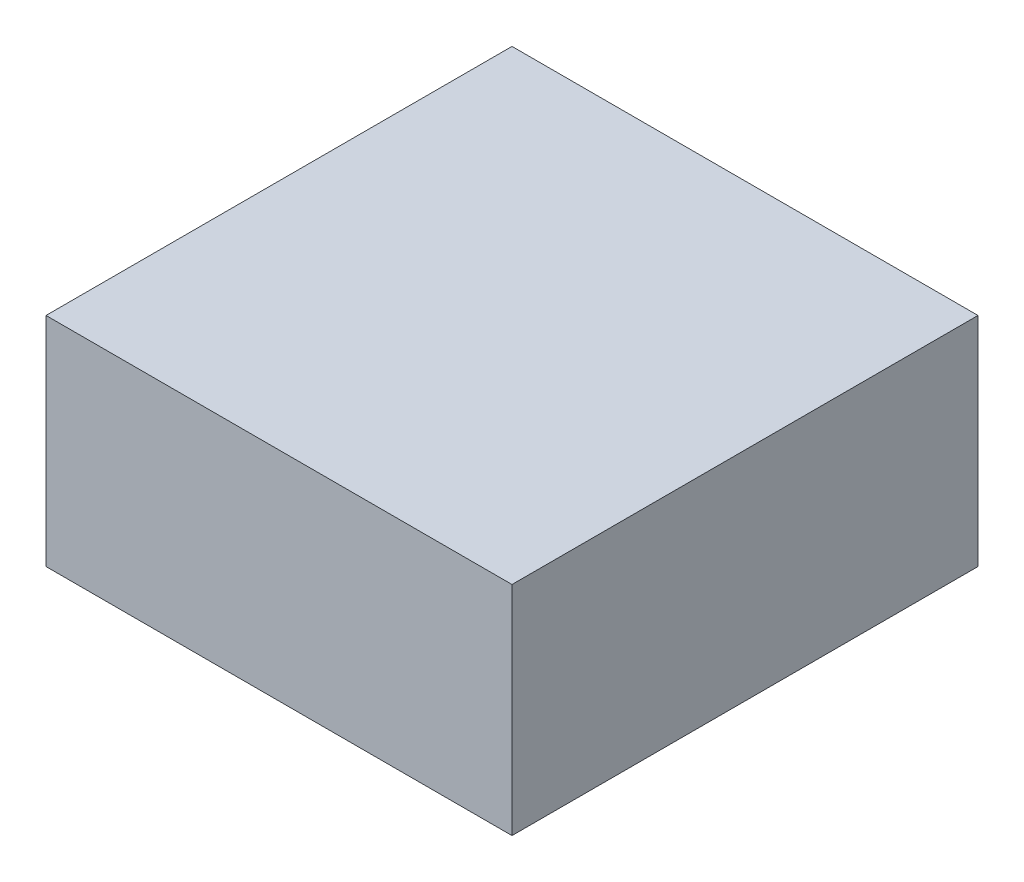
ISO-10303-21;
HEADER;
FILE_DESCRIPTION(('STEP AP214'),'2;1');
FILE_NAME('part.step','',(''),(''),'','','');
FILE_SCHEMA(('AUTOMOTIVE_DESIGN { 1 0 10303 214 1 1 1 1 }'));
ENDSEC;
DATA;
#1=APPLICATION_CONTEXT('core data for automotive mechanical design processes');
#2=APPLICATION_PROTOCOL_DEFINITION('international standard','automotive_design',2000,#1);
#3=PRODUCT_CONTEXT('',#1,'mechanical');
#4=PRODUCT('Part','Part','',(#3));
#5=PRODUCT_RELATED_PRODUCT_CATEGORY('part','',(#4));
#6=PRODUCT_DEFINITION_FORMATION('','',#4);
#7=PRODUCT_DEFINITION_CONTEXT('part definition',#1,'design');
#8=PRODUCT_DEFINITION('design','',#6,#7);
#9=PRODUCT_DEFINITION_SHAPE('','',#8);
#10=(LENGTH_UNIT() NAMED_UNIT(*) SI_UNIT(.MILLI.,.METRE.));
#11=(NAMED_UNIT(*) PLANE_ANGLE_UNIT() SI_UNIT($,.RADIAN.));
#12=(NAMED_UNIT(*) SI_UNIT($,.STERADIAN.) SOLID_ANGLE_UNIT());
#13=UNCERTAINTY_MEASURE_WITH_UNIT(LENGTH_MEASURE(1.E-05),#10,'distance_accuracy_value','');
#14=(GEOMETRIC_REPRESENTATION_CONTEXT(3) GLOBAL_UNCERTAINTY_ASSIGNED_CONTEXT((#13)) GLOBAL_UNIT_ASSIGNED_CONTEXT((#10,
#11,#12)) REPRESENTATION_CONTEXT('',''));
#15=CARTESIAN_POINT('',(0.,0.,0.));
#16=DIRECTION('',(0.,0.,1.));
#17=DIRECTION('',(1.,0.,0.));
#18=AXIS2_PLACEMENT_3D('',#15,#16,#17);
#19=CARTESIAN_POINT('',(75.,70.,75.));
#20=DIRECTION('',(-1.,0.,0.));
#21=DIRECTION('',(0.,0.,1.));
#22=AXIS2_PLACEMENT_3D('',#19,#20,#21);
#23=PLANE('',#22);
#24=DIRECTION('',(0.,0.,-1.));
#25=VECTOR('',#24,1.);
#26=CARTESIAN_POINT('',(75.,0.,75.));
#27=LINE('',#26,#25);
#28=CARTESIAN_POINT('',(75.,0.,75.));
#29=VERTEX_POINT('',#28);
#30=CARTESIAN_POINT('',(75.,0.,-75.));
#31=VERTEX_POINT('',#30);
#32=EDGE_CURVE('E96',#29,#31,#27,.T.);
#33=ORIENTED_EDGE('',*,*,#32,.T.);
#34=DIRECTION('',(0.,-1.,0.));
#35=VECTOR('',#34,1.);
#36=CARTESIAN_POINT('',(75.,70.,-75.));
#37=LINE('',#36,#35);
#38=CARTESIAN_POINT('',(75.,70.,-75.));
#39=VERTEX_POINT('',#38);
#40=EDGE_CURVE('E11',#39,#31,#37,.T.);
#41=ORIENTED_EDGE('',*,*,#40,.F.);
#42=DIRECTION('',(0.,0.,-1.));
#43=VECTOR('',#42,1.);
#44=CARTESIAN_POINT('',(75.,70.,75.));
#45=LINE('',#44,#43);
#46=CARTESIAN_POINT('',(75.,70.,75.));
#47=VERTEX_POINT('',#46);
#48=EDGE_CURVE('E84',#47,#39,#45,.T.);
#49=ORIENTED_EDGE('',*,*,#48,.F.);
#50=DIRECTION('',(0.,-1.,0.));
#51=VECTOR('',#50,1.);
#52=CARTESIAN_POINT('',(75.,70.,75.));
#53=LINE('',#52,#51);
#54=EDGE_CURVE('E92',#47,#29,#53,.T.);
#55=ORIENTED_EDGE('',*,*,#54,.T.);
#56=EDGE_LOOP('',(#33,#41,#49,#55));
#57=FACE_BOUND('',#56,.T.);
#58=ADVANCED_FACE('F33',(#57),#23,.F.);
#59=CARTESIAN_POINT('',(-75.,70.,-75.));
#60=DIRECTION('',(0.,0.,1.));
#61=DIRECTION('',(1.,0.,0.));
#62=AXIS2_PLACEMENT_3D('',#59,#60,#61);
#63=PLANE('',#62);
#64=DIRECTION('',(-1.,0.,0.));
#65=VECTOR('',#64,1.);
#66=CARTESIAN_POINT('',(-75.,0.,-75.));
#67=LINE('',#66,#65);
#68=CARTESIAN_POINT('',(-75.,0.,-75.));
#69=VERTEX_POINT('',#68);
#70=EDGE_CURVE('E88',#31,#69,#67,.T.);
#71=ORIENTED_EDGE('',*,*,#70,.T.);
#72=DIRECTION('',(0.,-1.,0.));
#73=VECTOR('',#72,1.);
#74=CARTESIAN_POINT('',(-75.,70.,-75.));
#75=LINE('',#74,#73);
#76=CARTESIAN_POINT('',(-75.,70.,-75.));
#77=VERTEX_POINT('',#76);
#78=EDGE_CURVE('E41',#77,#69,#75,.T.);
#79=ORIENTED_EDGE('',*,*,#78,.F.);
#80=DIRECTION('',(-1.,0.,0.));
#81=VECTOR('',#80,1.);
#82=CARTESIAN_POINT('',(-75.,70.,-75.));
#83=LINE('',#82,#81);
#84=EDGE_CURVE('E79',#39,#77,#83,.T.);
#85=ORIENTED_EDGE('',*,*,#84,.F.);
#86=ORIENTED_EDGE('',*,*,#40,.T.);
#87=EDGE_LOOP('',(#71,#79,#85,#86));
#88=FACE_BOUND('',#87,.T.);
#89=ADVANCED_FACE('F87',(#88),#63,.F.);
#90=CARTESIAN_POINT('',(-75.,70.,75.));
#91=DIRECTION('',(1.,0.,0.));
#92=DIRECTION('',(0.,0.,-1.));
#93=AXIS2_PLACEMENT_3D('',#90,#91,#92);
#94=PLANE('',#93);
#95=DIRECTION('',(0.,0.,1.));
#96=VECTOR('',#95,1.);
#97=CARTESIAN_POINT('',(-75.,0.,75.));
#98=LINE('',#97,#96);
#99=CARTESIAN_POINT('',(-75.,0.,75.));
#100=VERTEX_POINT('',#99);
#101=EDGE_CURVE('E66',#69,#100,#98,.T.);
#102=ORIENTED_EDGE('',*,*,#101,.T.);
#103=DIRECTION('',(0.,-1.,0.));
#104=VECTOR('',#103,1.);
#105=CARTESIAN_POINT('',(-75.,70.,75.));
#106=LINE('',#105,#104);
#107=CARTESIAN_POINT('',(-75.,70.,75.));
#108=VERTEX_POINT('',#107);
#109=EDGE_CURVE('E89',#108,#100,#106,.T.);
#110=ORIENTED_EDGE('',*,*,#109,.F.);
#111=DIRECTION('',(0.,0.,1.));
#112=VECTOR('',#111,1.);
#113=CARTESIAN_POINT('',(-75.,70.,75.));
#114=LINE('',#113,#112);
#115=EDGE_CURVE('E82',#77,#108,#114,.T.);
#116=ORIENTED_EDGE('',*,*,#115,.F.);
#117=ORIENTED_EDGE('',*,*,#78,.T.);
#118=EDGE_LOOP('',(#102,#110,#116,#117));
#119=FACE_BOUND('',#118,.T.);
#120=ADVANCED_FACE('F90',(#119),#94,.F.);
#121=CARTESIAN_POINT('',(-75.,70.,75.));
#122=DIRECTION('',(0.,0.,-1.));
#123=DIRECTION('',(-1.,0.,0.));
#124=AXIS2_PLACEMENT_3D('',#121,#122,#123);
#125=PLANE('',#124);
#126=DIRECTION('',(1.,0.,0.));
#127=VECTOR('',#126,1.);
#128=CARTESIAN_POINT('',(-75.,0.,75.));
#129=LINE('',#128,#127);
#130=EDGE_CURVE('E72',#100,#29,#129,.T.);
#131=ORIENTED_EDGE('',*,*,#130,.T.);
#132=ORIENTED_EDGE('',*,*,#54,.F.);
#133=DIRECTION('',(1.,0.,0.));
#134=VECTOR('',#133,1.);
#135=CARTESIAN_POINT('',(-75.,70.,75.));
#136=LINE('',#135,#134);
#137=EDGE_CURVE('E49',#108,#47,#136,.T.);
#138=ORIENTED_EDGE('',*,*,#137,.F.);
#139=ORIENTED_EDGE('',*,*,#109,.T.);
#140=EDGE_LOOP('',(#131,#132,#138,#139));
#141=FACE_BOUND('',#140,.T.);
#142=ADVANCED_FACE('F103',(#141),#125,.F.);
#143=CARTESIAN_POINT('',(0.,70.,0.));
#144=DIRECTION('',(0.,-1.,0.));
#145=DIRECTION('',(0.,0.,-1.));
#146=AXIS2_PLACEMENT_3D('',#143,#144,#145);
#147=PLANE('',#146);
#148=ORIENTED_EDGE('',*,*,#48,.T.);
#149=ORIENTED_EDGE('',*,*,#84,.T.);
#150=ORIENTED_EDGE('',*,*,#115,.T.);
#151=ORIENTED_EDGE('',*,*,#137,.T.);
#152=EDGE_LOOP('',(#148,#149,#150,#151));
#153=FACE_BOUND('',#152,.T.);
#154=ADVANCED_FACE('F80',(#153),#147,.F.);
#155=CARTESIAN_POINT('',(0.,0.,0.));
#156=DIRECTION('',(0.,-1.,0.));
#157=DIRECTION('',(0.,0.,-1.));
#158=AXIS2_PLACEMENT_3D('',#155,#156,#157);
#159=PLANE('',#158);
#160=ORIENTED_EDGE('',*,*,#32,.F.);
#161=ORIENTED_EDGE('',*,*,#130,.F.);
#162=ORIENTED_EDGE('',*,*,#101,.F.);
#163=ORIENTED_EDGE('',*,*,#70,.F.);
#164=EDGE_LOOP('',(#160,#161,#162,#163));
#165=FACE_BOUND('',#164,.T.);
#166=ADVANCED_FACE('F106',(#165),#159,.T.);
#167=CLOSED_SHELL('',(#58,#89,#120,#142,#154,#166));
#168=MANIFOLD_SOLID_BREP('B2',#167);
#169=ADVANCED_BREP_SHAPE_REPRESENTATION('',(#18,#168),#14);
#170=SHAPE_DEFINITION_REPRESENTATION(#9,#169);
ENDSEC;
END-ISO-10303-21;
